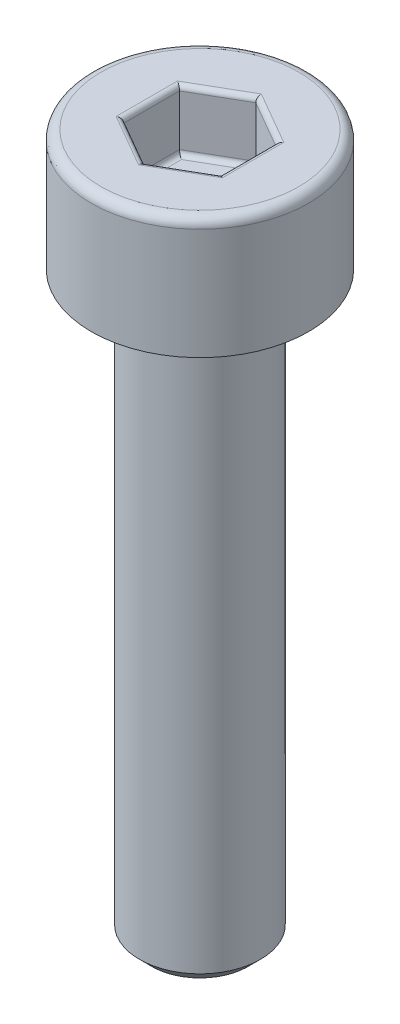
ISO-10303-21;
HEADER;
FILE_DESCRIPTION(('STEP AP214'),'2;1');
FILE_NAME('part.step','',(''),(''),'','','');
FILE_SCHEMA(('AUTOMOTIVE_DESIGN { 1 0 10303 214 1 1 1 1 }'));
ENDSEC;
DATA;
#1=APPLICATION_CONTEXT('core data for automotive mechanical design processes');
#2=APPLICATION_PROTOCOL_DEFINITION('international standard','automotive_design',2000,#1);
#3=PRODUCT_CONTEXT('',#1,'mechanical');
#4=PRODUCT('Part','Part','',(#3));
#5=PRODUCT_RELATED_PRODUCT_CATEGORY('part','',(#4));
#6=PRODUCT_DEFINITION_FORMATION('','',#4);
#7=PRODUCT_DEFINITION_CONTEXT('part definition',#1,'design');
#8=PRODUCT_DEFINITION('design','',#6,#7);
#9=PRODUCT_DEFINITION_SHAPE('','',#8);
#10=(LENGTH_UNIT() NAMED_UNIT(*) SI_UNIT(.MILLI.,.METRE.));
#11=(NAMED_UNIT(*) PLANE_ANGLE_UNIT() SI_UNIT($,.RADIAN.));
#12=(NAMED_UNIT(*) SI_UNIT($,.STERADIAN.) SOLID_ANGLE_UNIT());
#13=UNCERTAINTY_MEASURE_WITH_UNIT(LENGTH_MEASURE(1.E-05),#10,'distance_accuracy_value','');
#14=(GEOMETRIC_REPRESENTATION_CONTEXT(3) GLOBAL_UNCERTAINTY_ASSIGNED_CONTEXT((#13)) GLOBAL_UNIT_ASSIGNED_CONTEXT((#10,
#11,#12)) REPRESENTATION_CONTEXT('',''));
#15=CARTESIAN_POINT('',(0.,0.,0.));
#16=DIRECTION('',(0.,0.,1.));
#17=DIRECTION('',(1.,0.,0.));
#18=AXIS2_PLACEMENT_3D('',#15,#16,#17);
#19=CARTESIAN_POINT('',(0.,-14.5,0.));
#20=DIRECTION('',(0.,-1.,0.));
#21=DIRECTION('',(0.,0.,-1.));
#22=AXIS2_PLACEMENT_3D('',#19,#20,#21);
#23=PLANE('',#22);
#24=CARTESIAN_POINT('',(0.,-14.5,0.));
#25=DIRECTION('',(0.,-1.,0.));
#26=DIRECTION('',(0.,0.,-1.));
#27=AXIS2_PLACEMENT_3D('',#24,#25,#26);
#28=CIRCLE('',#27,0.999999999999996);
#29=CARTESIAN_POINT('',(0.,-14.5,-0.999999999999996));
#30=VERTEX_POINT('',#29);
#31=EDGE_CURVE('E261',#30,#30,#28,.T.);
#32=ORIENTED_EDGE('',*,*,#31,.T.);
#33=EDGE_LOOP('',(#32));
#34=FACE_BOUND('',#33,.T.);
#35=ADVANCED_FACE('F33',(#34),#23,.T.);
#36=CARTESIAN_POINT('',(0.,0.,0.));
#37=DIRECTION('',(0.,1.,0.));
#38=DIRECTION('',(0.,0.,1.));
#39=AXIS2_PLACEMENT_3D('',#36,#37,#38);
#40=CYLINDRICAL_SURFACE('',#39,1.25);
#41=CARTESIAN_POINT('',(0.,-2.75,0.));
#42=DIRECTION('',(0.,-1.,0.));
#43=DIRECTION('',(0.,0.,-1.));
#44=AXIS2_PLACEMENT_3D('',#41,#42,#43);
#45=CIRCLE('',#44,1.25);
#46=CARTESIAN_POINT('',(0.,-2.75,-1.25));
#47=VERTEX_POINT('',#46);
#48=EDGE_CURVE('E258',#47,#47,#45,.T.);
#49=ORIENTED_EDGE('',*,*,#48,.T.);
#50=EDGE_LOOP('',(#49));
#51=FACE_BOUND('',#50,.T.);
#52=CARTESIAN_POINT('',(0.,-14.25,0.));
#53=DIRECTION('',(0.,-1.,0.));
#54=DIRECTION('',(0.,0.,-1.));
#55=AXIS2_PLACEMENT_3D('',#52,#53,#54);
#56=CIRCLE('',#55,1.25);
#57=CARTESIAN_POINT('',(0.,-14.25,-1.25));
#58=VERTEX_POINT('',#57);
#59=EDGE_CURVE('E255',#58,#58,#56,.F.);
#60=ORIENTED_EDGE('',*,*,#59,.T.);
#61=EDGE_LOOP('',(#60));
#62=FACE_BOUND('',#61,.T.);
#63=ADVANCED_FACE('F287',(#51,#62),#40,.T.);
#64=CARTESIAN_POINT('',(-1.25,-2.5,0.));
#65=DIRECTION('',(0.,-1.,0.));
#66=DIRECTION('',(0.,0.,-1.));
#67=AXIS2_PLACEMENT_3D('',#64,#65,#66);
#68=PLANE('',#67);
#69=CARTESIAN_POINT('',(0.,-2.5,0.));
#70=DIRECTION('',(0.,-1.,0.));
#71=DIRECTION('',(0.,0.,-1.));
#72=AXIS2_PLACEMENT_3D('',#69,#70,#71);
#73=CIRCLE('',#72,1.5);
#74=CARTESIAN_POINT('',(0.,-2.5,-1.5));
#75=VERTEX_POINT('',#74);
#76=EDGE_CURVE('E252',#75,#75,#73,.F.);
#77=ORIENTED_EDGE('',*,*,#76,.T.);
#78=EDGE_LOOP('',(#77));
#79=FACE_BOUND('',#78,.T.);
#80=CARTESIAN_POINT('',(0.,-2.5,0.));
#81=DIRECTION('',(0.,1.,0.));
#82=DIRECTION('',(0.,0.,1.));
#83=AXIS2_PLACEMENT_3D('',#80,#81,#82);
#84=CIRCLE('',#83,2.25);
#85=CARTESIAN_POINT('',(0.,-2.5,2.25));
#86=VERTEX_POINT('',#85);
#87=EDGE_CURVE('E249',#86,#86,#84,.T.);
#88=ORIENTED_EDGE('',*,*,#87,.F.);
#89=EDGE_LOOP('',(#88));
#90=FACE_BOUND('',#89,.T.);
#91=ADVANCED_FACE('F293',(#79,#90),#68,.T.);
#92=CARTESIAN_POINT('',(0.,0.,0.));
#93=DIRECTION('',(0.,1.,0.));
#94=DIRECTION('',(0.,0.,1.));
#95=AXIS2_PLACEMENT_3D('',#92,#93,#94);
#96=CYLINDRICAL_SURFACE('',#95,2.25);
#97=CARTESIAN_POINT('',(0.,-0.2,0.));
#98=DIRECTION('',(0.,1.,0.));
#99=DIRECTION('',(0.,0.,1.));
#100=AXIS2_PLACEMENT_3D('',#97,#98,#99);
#101=CIRCLE('',#100,2.25);
#102=CARTESIAN_POINT('',(0.,-0.2,2.25));
#103=VERTEX_POINT('',#102);
#104=EDGE_CURVE('E159',#103,#103,#101,.F.);
#105=ORIENTED_EDGE('',*,*,#104,.T.);
#106=EDGE_LOOP('',(#105));
#107=FACE_BOUND('',#106,.T.);
#108=ORIENTED_EDGE('',*,*,#87,.T.);
#109=EDGE_LOOP('',(#108));
#110=FACE_BOUND('',#109,.T.);
#111=ADVANCED_FACE('F303',(#107,#110),#96,.T.);
#112=CARTESIAN_POINT('',(-2.25,0.,0.));
#113=DIRECTION('',(0.,1.,0.));
#114=DIRECTION('',(0.,0.,1.));
#115=AXIS2_PLACEMENT_3D('',#112,#113,#114);
#116=PLANE('',#115);
#117=DIRECTION('',(0.,0.,1.));
#118=VECTOR('',#117,1.);
#119=CARTESIAN_POINT('',(-1.1,0.,-0.577350269189627));
#120=LINE('',#119,#118);
#121=CARTESIAN_POINT('',(-1.1,0.,0.635085296108588));
#122=VERTEX_POINT('',#121);
#123=CARTESIAN_POINT('',(-1.1,0.,-0.635085296108589));
#124=VERTEX_POINT('',#123);
#125=EDGE_CURVE('E175',#122,#124,#120,.F.);
#126=ORIENTED_EDGE('',*,*,#125,.T.);
#127=DIRECTION('',(-0.866025403784439,0.,0.5));
#128=VECTOR('',#127,1.);
#129=CARTESIAN_POINT('',(-0.0500000000000009,0.,-1.2413030787577));
#130=LINE('',#129,#128);
#131=CARTESIAN_POINT('',(0.,0.,-1.27017059221718));
#132=VERTEX_POINT('',#131);
#133=EDGE_CURVE('E134',#124,#132,#130,.F.);
#134=ORIENTED_EDGE('',*,*,#133,.T.);
#135=DIRECTION('',(-0.866025403784439,0.,-0.5));
#136=VECTOR('',#135,1.);
#137=CARTESIAN_POINT('',(1.05,0.,-0.663952809568071));
#138=LINE('',#137,#136);
#139=CARTESIAN_POINT('',(1.1,0.,-0.63508529610859));
#140=VERTEX_POINT('',#139);
#141=EDGE_CURVE('E161',#132,#140,#138,.F.);
#142=ORIENTED_EDGE('',*,*,#141,.T.);
#143=DIRECTION('',(0.,0.,-1.));
#144=VECTOR('',#143,1.);
#145=CARTESIAN_POINT('',(1.1,0.,0.577350269189625));
#146=LINE('',#145,#144);
#147=CARTESIAN_POINT('',(1.1,0.,0.635085296108588));
#148=VERTEX_POINT('',#147);
#149=EDGE_CURVE('E169',#140,#148,#146,.F.);
#150=ORIENTED_EDGE('',*,*,#149,.T.);
#151=DIRECTION('',(0.866025403784439,0.,-0.5));
#152=VECTOR('',#151,1.);
#153=CARTESIAN_POINT('',(0.0499999999999991,0.,1.24130307875769));
#154=LINE('',#153,#152);
#155=CARTESIAN_POINT('',(0.,0.,1.27017059221718));
#156=VERTEX_POINT('',#155);
#157=EDGE_CURVE('E171',#148,#156,#154,.F.);
#158=ORIENTED_EDGE('',*,*,#157,.T.);
#159=DIRECTION('',(0.866025403784439,0.,0.5));
#160=VECTOR('',#159,1.);
#161=CARTESIAN_POINT('',(-1.05,0.,0.663952809568069));
#162=LINE('',#161,#160);
#163=EDGE_CURVE('E173',#156,#122,#162,.F.);
#164=ORIENTED_EDGE('',*,*,#163,.T.);
#165=EDGE_LOOP('',(#126,#134,#142,#150,#158,#164));
#166=FACE_BOUND('',#165,.T.);
#167=CARTESIAN_POINT('',(0.,0.,0.));
#168=DIRECTION('',(0.,1.,0.));
#169=DIRECTION('',(0.,0.,1.));
#170=AXIS2_PLACEMENT_3D('',#167,#168,#169);
#171=CIRCLE('',#170,2.05);
#172=CARTESIAN_POINT('',(0.,0.,2.05));
#173=VERTEX_POINT('',#172);
#174=EDGE_CURVE('E164',#173,#173,#171,.T.);
#175=ORIENTED_EDGE('',*,*,#174,.T.);
#176=EDGE_LOOP('',(#175));
#177=FACE_BOUND('',#176,.T.);
#178=ADVANCED_FACE('F266',(#166,#177),#116,.T.);
#179=CARTESIAN_POINT('',(0.,-2.5,0.));
#180=DIRECTION('',(0.,1.,0.));
#181=DIRECTION('',(0.,0.,1.));
#182=AXIS2_PLACEMENT_3D('',#179,#180,#181);
#183=CONICAL_SURFACE('',#182,1.5,0.78539816339745);
#184=ORIENTED_EDGE('',*,*,#48,.F.);
#185=EDGE_LOOP('',(#184));
#186=FACE_BOUND('',#185,.T.);
#187=ORIENTED_EDGE('',*,*,#76,.F.);
#188=EDGE_LOOP('',(#187));
#189=FACE_BOUND('',#188,.T.);
#190=ADVANCED_FACE('F281',(#186,#189),#183,.T.);
#191=CARTESIAN_POINT('',(0.,-14.25,0.));
#192=DIRECTION('',(0.,1.,0.));
#193=DIRECTION('',(0.,0.,1.));
#194=AXIS2_PLACEMENT_3D('',#191,#192,#193);
#195=CONICAL_SURFACE('',#194,1.25,0.785398163397454);
#196=ORIENTED_EDGE('',*,*,#31,.F.);
#197=EDGE_LOOP('',(#196));
#198=FACE_BOUND('',#197,.T.);
#199=ORIENTED_EDGE('',*,*,#59,.F.);
#200=EDGE_LOOP('',(#199));
#201=FACE_BOUND('',#200,.T.);
#202=ADVANCED_FACE('F271',(#198,#201),#195,.T.);
#203=CARTESIAN_POINT('',(0.,-0.2,0.));
#204=DIRECTION('',(0.,1.,0.));
#205=DIRECTION('',(0.,0.,1.));
#206=AXIS2_PLACEMENT_3D('',#203,#204,#205);
#207=TOROIDAL_SURFACE('',#206,2.05,0.2);
#208=ORIENTED_EDGE('',*,*,#104,.F.);
#209=EDGE_LOOP('',(#208));
#210=FACE_BOUND('',#209,.T.);
#211=ORIENTED_EDGE('',*,*,#174,.F.);
#212=EDGE_LOOP('',(#211));
#213=FACE_BOUND('',#212,.T.);
#214=ADVANCED_FACE('F268',(#210,#213),#207,.T.);
#215=CARTESIAN_POINT('',(0.999999999999998,-1.25,-0.577350269189627));
#216=DIRECTION('',(0.5,0.,-0.866025403784439));
#217=DIRECTION('',(-0.866025403784439,0.,-0.5));
#218=AXIS2_PLACEMENT_3D('',#215,#216,#217);
#219=PLANE('',#218);
#220=DIRECTION('',(0.,1.,0.));
#221=VECTOR('',#220,1.);
#222=CARTESIAN_POINT('',(0.999999999999998,-1.25,-0.577350269189627));
#223=LINE('',#222,#221);
#224=CARTESIAN_POINT('',(0.999999999999998,-1.15,-0.577350269189627));
#225=VERTEX_POINT('',#224);
#226=CARTESIAN_POINT('',(0.999999999999998,-0.1,-0.577350269189627));
#227=VERTEX_POINT('',#226);
#228=EDGE_CURVE('E243',#225,#227,#223,.T.);
#229=ORIENTED_EDGE('',*,*,#228,.T.);
#230=DIRECTION('',(-0.866025403784439,0.,-0.5));
#231=VECTOR('',#230,1.);
#232=CARTESIAN_POINT('',(0.,-0.1,-1.15470053837925));
#233=LINE('',#232,#231);
#234=CARTESIAN_POINT('',(0.,-0.1,-1.15470053837925));
#235=VERTEX_POINT('',#234);
#236=EDGE_CURVE('E195',#227,#235,#233,.T.);
#237=ORIENTED_EDGE('',*,*,#236,.T.);
#238=DIRECTION('',(0.,1.,0.));
#239=VECTOR('',#238,1.);
#240=CARTESIAN_POINT('',(0.,-1.25,-1.15470053837925));
#241=LINE('',#240,#239);
#242=CARTESIAN_POINT('',(0.,-1.15,-1.15470053837925));
#243=VERTEX_POINT('',#242);
#244=EDGE_CURVE('E145',#243,#235,#241,.T.);
#245=ORIENTED_EDGE('',*,*,#244,.F.);
#246=DIRECTION('',(-0.866025403784439,0.,-0.5));
#247=VECTOR('',#246,1.);
#248=CARTESIAN_POINT('',(0.999999999999998,-1.15,-0.577350269189627));
#249=LINE('',#248,#247);
#250=EDGE_CURVE('E193',#243,#225,#249,.F.);
#251=ORIENTED_EDGE('',*,*,#250,.T.);
#252=EDGE_LOOP('',(#229,#237,#245,#251));
#253=FACE_BOUND('',#252,.T.);
#254=ADVANCED_FACE('F270',(#253),#219,.F.);
#255=CARTESIAN_POINT('',(0.999999999999999,-1.25,0.577350269189625));
#256=DIRECTION('',(1.,0.,0.));
#257=DIRECTION('',(0.,0.,-1.));
#258=AXIS2_PLACEMENT_3D('',#255,#256,#257);
#259=PLANE('',#258);
#260=DIRECTION('',(0.,1.,0.));
#261=VECTOR('',#260,1.);
#262=CARTESIAN_POINT('',(0.999999999999999,-1.25,0.577350269189625));
#263=LINE('',#262,#261);
#264=CARTESIAN_POINT('',(0.999999999999999,-1.15,0.577350269189625));
#265=VERTEX_POINT('',#264);
#266=CARTESIAN_POINT('',(0.999999999999999,-0.1,0.577350269189625));
#267=VERTEX_POINT('',#266);
#268=EDGE_CURVE('E240',#265,#267,#263,.T.);
#269=ORIENTED_EDGE('',*,*,#268,.T.);
#270=DIRECTION('',(0.,0.,-1.));
#271=VECTOR('',#270,1.);
#272=CARTESIAN_POINT('',(0.999999999999998,-0.1,-0.577350269189627));
#273=LINE('',#272,#271);
#274=EDGE_CURVE('E191',#267,#227,#273,.T.);
#275=ORIENTED_EDGE('',*,*,#274,.T.);
#276=ORIENTED_EDGE('',*,*,#228,.F.);
#277=DIRECTION('',(0.,0.,-1.));
#278=VECTOR('',#277,1.);
#279=CARTESIAN_POINT('',(0.999999999999999,-1.15,0.577350269189625));
#280=LINE('',#279,#278);
#281=EDGE_CURVE('E188',#225,#265,#280,.F.);
#282=ORIENTED_EDGE('',*,*,#281,.T.);
#283=EDGE_LOOP('',(#269,#275,#276,#282));
#284=FACE_BOUND('',#283,.T.);
#285=ADVANCED_FACE('F278',(#284),#259,.F.);
#286=CARTESIAN_POINT('',(0.,-1.25,1.15470053837925));
#287=DIRECTION('',(0.5,0.,0.866025403784439));
#288=DIRECTION('',(0.866025403784439,0.,-0.5));
#289=AXIS2_PLACEMENT_3D('',#286,#287,#288);
#290=PLANE('',#289);
#291=DIRECTION('',(0.,1.,0.));
#292=VECTOR('',#291,1.);
#293=CARTESIAN_POINT('',(0.,-1.25,1.15470053837925));
#294=LINE('',#293,#292);
#295=CARTESIAN_POINT('',(0.,-1.15,1.15470053837925));
#296=VERTEX_POINT('',#295);
#297=CARTESIAN_POINT('',(0.,-0.1,1.15470053837925));
#298=VERTEX_POINT('',#297);
#299=EDGE_CURVE('E237',#296,#298,#294,.T.);
#300=ORIENTED_EDGE('',*,*,#299,.T.);
#301=DIRECTION('',(0.866025403784439,0.,-0.5));
#302=VECTOR('',#301,1.);
#303=CARTESIAN_POINT('',(0.999999999999999,-0.1,0.577350269189625));
#304=LINE('',#303,#302);
#305=EDGE_CURVE('E186',#298,#267,#304,.T.);
#306=ORIENTED_EDGE('',*,*,#305,.T.);
#307=ORIENTED_EDGE('',*,*,#268,.F.);
#308=DIRECTION('',(0.866025403784439,0.,-0.5));
#309=VECTOR('',#308,1.);
#310=CARTESIAN_POINT('',(0.,-1.15,1.15470053837925));
#311=LINE('',#310,#309);
#312=EDGE_CURVE('E184',#265,#296,#311,.F.);
#313=ORIENTED_EDGE('',*,*,#312,.T.);
#314=EDGE_LOOP('',(#300,#306,#307,#313));
#315=FACE_BOUND('',#314,.T.);
#316=ADVANCED_FACE('F327',(#315),#290,.F.);
#317=CARTESIAN_POINT('',(-1.,-1.25,0.577350269189625));
#318=DIRECTION('',(-0.5,0.,0.866025403784438));
#319=DIRECTION('',(0.866025403784439,0.,0.5));
#320=AXIS2_PLACEMENT_3D('',#317,#318,#319);
#321=PLANE('',#320);
#322=DIRECTION('',(0.,1.,0.));
#323=VECTOR('',#322,1.);
#324=CARTESIAN_POINT('',(-1.,-1.25,0.577350269189625));
#325=LINE('',#324,#323);
#326=CARTESIAN_POINT('',(-1.,-1.15,0.577350269189625));
#327=VERTEX_POINT('',#326);
#328=CARTESIAN_POINT('',(-1.,-0.1,0.577350269189625));
#329=VERTEX_POINT('',#328);
#330=EDGE_CURVE('E128',#327,#329,#325,.T.);
#331=ORIENTED_EDGE('',*,*,#330,.T.);
#332=DIRECTION('',(0.866025403784439,0.,0.5));
#333=VECTOR('',#332,1.);
#334=CARTESIAN_POINT('',(0.,-0.1,1.15470053837925));
#335=LINE('',#334,#333);
#336=EDGE_CURVE('E182',#329,#298,#335,.T.);
#337=ORIENTED_EDGE('',*,*,#336,.T.);
#338=ORIENTED_EDGE('',*,*,#299,.F.);
#339=DIRECTION('',(0.866025403784439,0.,0.5));
#340=VECTOR('',#339,1.);
#341=CARTESIAN_POINT('',(-1.,-1.15,0.577350269189625));
#342=LINE('',#341,#340);
#343=EDGE_CURVE('E180',#296,#327,#342,.F.);
#344=ORIENTED_EDGE('',*,*,#343,.T.);
#345=EDGE_LOOP('',(#331,#337,#338,#344));
#346=FACE_BOUND('',#345,.T.);
#347=ADVANCED_FACE('F234',(#346),#321,.F.);
#348=CARTESIAN_POINT('',(-1.,-1.25,-0.577350269189627));
#349=DIRECTION('',(-1.,0.,0.));
#350=DIRECTION('',(0.,0.,1.));
#351=AXIS2_PLACEMENT_3D('',#348,#349,#350);
#352=PLANE('',#351);
#353=DIRECTION('',(0.,1.,0.));
#354=VECTOR('',#353,1.);
#355=CARTESIAN_POINT('',(-1.,-1.25,-0.577350269189627));
#356=LINE('',#355,#354);
#357=CARTESIAN_POINT('',(-1.,-1.15,-0.577350269189627));
#358=VERTEX_POINT('',#357);
#359=CARTESIAN_POINT('',(-1.,-0.1,-0.577350269189627));
#360=VERTEX_POINT('',#359);
#361=EDGE_CURVE('E126',#358,#360,#356,.T.);
#362=ORIENTED_EDGE('',*,*,#361,.T.);
#363=DIRECTION('',(0.,0.,1.));
#364=VECTOR('',#363,1.);
#365=CARTESIAN_POINT('',(-1.,-0.1,0.577350269189625));
#366=LINE('',#365,#364);
#367=EDGE_CURVE('E133',#360,#329,#366,.T.);
#368=ORIENTED_EDGE('',*,*,#367,.T.);
#369=ORIENTED_EDGE('',*,*,#330,.F.);
#370=DIRECTION('',(0.,0.,1.));
#371=VECTOR('',#370,1.);
#372=CARTESIAN_POINT('',(-1.,-1.15,-0.577350269189627));
#373=LINE('',#372,#371);
#374=EDGE_CURVE('E123',#327,#358,#373,.F.);
#375=ORIENTED_EDGE('',*,*,#374,.T.);
#376=EDGE_LOOP('',(#362,#368,#369,#375));
#377=FACE_BOUND('',#376,.T.);
#378=ADVANCED_FACE('F125',(#377),#352,.F.);
#379=CARTESIAN_POINT('',(0.,-1.25,-1.15470053837925));
#380=DIRECTION('',(-0.5,0.,-0.866025403784438));
#381=DIRECTION('',(-0.866025403784439,0.,0.5));
#382=AXIS2_PLACEMENT_3D('',#379,#380,#381);
#383=PLANE('',#382);
#384=ORIENTED_EDGE('',*,*,#244,.T.);
#385=DIRECTION('',(-0.866025403784439,0.,0.5));
#386=VECTOR('',#385,1.);
#387=CARTESIAN_POINT('',(-1.,-0.1,-0.577350269189626));
#388=LINE('',#387,#386);
#389=EDGE_CURVE('E144',#235,#360,#388,.T.);
#390=ORIENTED_EDGE('',*,*,#389,.T.);
#391=ORIENTED_EDGE('',*,*,#361,.F.);
#392=DIRECTION('',(-0.866025403784439,0.,0.5));
#393=VECTOR('',#392,1.);
#394=CARTESIAN_POINT('',(0.,-1.15,-1.15470053837925));
#395=LINE('',#394,#393);
#396=EDGE_CURVE('E141',#358,#243,#395,.F.);
#397=ORIENTED_EDGE('',*,*,#396,.T.);
#398=EDGE_LOOP('',(#384,#390,#391,#397));
#399=FACE_BOUND('',#398,.T.);
#400=ADVANCED_FACE('F139',(#399),#383,.F.);
#401=CARTESIAN_POINT('',(0.,-1.25,-1.15470053837925));
#402=DIRECTION('',(0.,1.,0.));
#403=DIRECTION('',(0.,0.,1.));
#404=AXIS2_PLACEMENT_3D('',#401,#402,#403);
#405=PLANE('',#404);
#406=DIRECTION('',(0.866025403784439,0.,-0.5));
#407=VECTOR('',#406,1.);
#408=CARTESIAN_POINT('',(0.949999999999999,-1.25,0.490747728811181));
#409=LINE('',#408,#407);
#410=CARTESIAN_POINT('',(0.,-1.25,1.03923048454133));
#411=VERTEX_POINT('',#410);
#412=CARTESIAN_POINT('',(0.899999999999999,-1.25,0.519615242270663));
#413=VERTEX_POINT('',#412);
#414=EDGE_CURVE('E42',#411,#413,#409,.T.);
#415=ORIENTED_EDGE('',*,*,#414,.T.);
#416=DIRECTION('',(0.,0.,-1.));
#417=VECTOR('',#416,1.);
#418=CARTESIAN_POINT('',(0.899999999999998,-1.25,-1.15470053837925));
#419=LINE('',#418,#417);
#420=CARTESIAN_POINT('',(0.899999999999998,-1.25,-0.519615242270664));
#421=VERTEX_POINT('',#420);
#422=EDGE_CURVE('E11',#413,#421,#419,.T.);
#423=ORIENTED_EDGE('',*,*,#422,.T.);
#424=DIRECTION('',(-0.866025403784439,0.,-0.5));
#425=VECTOR('',#424,1.);
#426=CARTESIAN_POINT('',(-0.0500000000000008,-1.25,-1.06809799800081));
#427=LINE('',#426,#425);
#428=CARTESIAN_POINT('',(0.,-1.25,-1.03923048454133));
#429=VERTEX_POINT('',#428);
#430=EDGE_CURVE('E197',#421,#429,#427,.T.);
#431=ORIENTED_EDGE('',*,*,#430,.T.);
#432=DIRECTION('',(-0.866025403784439,0.,0.5));
#433=VECTOR('',#432,1.);
#434=CARTESIAN_POINT('',(0.0499999999999993,-1.25,-1.06809799800081));
#435=LINE('',#434,#433);
#436=CARTESIAN_POINT('',(-0.9,-1.25,-0.519615242270664));
#437=VERTEX_POINT('',#436);
#438=EDGE_CURVE('E199',#429,#437,#435,.T.);
#439=ORIENTED_EDGE('',*,*,#438,.T.);
#440=DIRECTION('',(0.,0.,1.));
#441=VECTOR('',#440,1.);
#442=CARTESIAN_POINT('',(-0.9,-1.25,-1.15470053837925));
#443=LINE('',#442,#441);
#444=CARTESIAN_POINT('',(-0.9,-1.25,0.519615242270662));
#445=VERTEX_POINT('',#444);
#446=EDGE_CURVE('E150',#437,#445,#443,.T.);
#447=ORIENTED_EDGE('',*,*,#446,.T.);
#448=DIRECTION('',(0.866025403784439,0.,0.5));
#449=VECTOR('',#448,1.);
#450=CARTESIAN_POINT('',(-0.950000000000001,-1.25,0.490747728811181));
#451=LINE('',#450,#449);
#452=EDGE_CURVE('E53',#445,#411,#451,.T.);
#453=ORIENTED_EDGE('',*,*,#452,.T.);
#454=EDGE_LOOP('',(#415,#423,#431,#439,#447,#453));
#455=FACE_BOUND('',#454,.T.);
#456=ADVANCED_FACE('F322',(#455),#405,.T.);
#457=CARTESIAN_POINT('',(0.0499999999999991,-0.1,1.24130307875769));
#458=DIRECTION('',(-0.866025403784439,0.,0.5));
#459=DIRECTION('',(0.5,0.,0.866025403784439));
#460=AXIS2_PLACEMENT_3D('',#457,#458,#459);
#461=CYLINDRICAL_SURFACE('',#460,0.1);
#462=CARTESIAN_POINT('',(0.,-0.1,1.27017059221718));
#463=DIRECTION('',(-1.,0.,0.));
#464=DIRECTION('',(0.,0.,-1.));
#465=AXIS2_PLACEMENT_3D('',#462,#463,#464);
#466=ELLIPSE('',#465,0.115470053837925,0.1);
#467=EDGE_CURVE('E214',#156,#298,#466,.T.);
#468=ORIENTED_EDGE('',*,*,#467,.F.);
#469=ORIENTED_EDGE('',*,*,#157,.F.);
#470=CARTESIAN_POINT('',(1.1,-0.1,0.635085296108588));
#471=DIRECTION('',(-0.5,0.,0.866025403784439));
#472=DIRECTION('',(-0.866025403784439,0.,-0.5));
#473=AXIS2_PLACEMENT_3D('',#470,#471,#472);
#474=ELLIPSE('',#473,0.115470053837925,0.1);
#475=EDGE_CURVE('E217',#267,#148,#474,.F.);
#476=ORIENTED_EDGE('',*,*,#475,.F.);
#477=ORIENTED_EDGE('',*,*,#305,.F.);
#478=EDGE_LOOP('',(#468,#469,#476,#477));
#479=FACE_BOUND('',#478,.T.);
#480=ADVANCED_FACE('F334',(#479),#461,.T.);
#481=CARTESIAN_POINT('',(1.1,-0.1,0.577350269189625));
#482=DIRECTION('',(0.,0.,1.));
#483=DIRECTION('',(1.,0.,0.));
#484=AXIS2_PLACEMENT_3D('',#481,#482,#483);
#485=CYLINDRICAL_SURFACE('',#484,0.1);
#486=ORIENTED_EDGE('',*,*,#475,.T.);
#487=ORIENTED_EDGE('',*,*,#149,.F.);
#488=CARTESIAN_POINT('',(1.1,-0.1,-0.63508529610859));
#489=DIRECTION('',(0.5,0.,0.866025403784439));
#490=DIRECTION('',(-0.866025403784439,0.,0.5));
#491=AXIS2_PLACEMENT_3D('',#488,#489,#490);
#492=ELLIPSE('',#491,0.115470053837925,0.1);
#493=EDGE_CURVE('E211',#227,#140,#492,.F.);
#494=ORIENTED_EDGE('',*,*,#493,.F.);
#495=ORIENTED_EDGE('',*,*,#274,.F.);
#496=EDGE_LOOP('',(#486,#487,#494,#495));
#497=FACE_BOUND('',#496,.T.);
#498=ADVANCED_FACE('F338',(#497),#485,.T.);
#499=CARTESIAN_POINT('',(-1.05,-0.1,0.663952809568069));
#500=DIRECTION('',(-0.866025403784439,0.,-0.5));
#501=DIRECTION('',(-0.5,0.,0.866025403784438));
#502=AXIS2_PLACEMENT_3D('',#499,#500,#501);
#503=CYLINDRICAL_SURFACE('',#502,0.1);
#504=ORIENTED_EDGE('',*,*,#467,.T.);
#505=ORIENTED_EDGE('',*,*,#336,.F.);
#506=CARTESIAN_POINT('',(-1.1,-0.1,0.635085296108587));
#507=DIRECTION('',(-0.5,0.,-0.866025403784439));
#508=DIRECTION('',(0.866025403784439,0.,-0.5));
#509=AXIS2_PLACEMENT_3D('',#506,#507,#508);
#510=ELLIPSE('',#509,0.115470053837925,0.1);
#511=EDGE_CURVE('E208',#122,#329,#510,.T.);
#512=ORIENTED_EDGE('',*,*,#511,.F.);
#513=ORIENTED_EDGE('',*,*,#163,.F.);
#514=EDGE_LOOP('',(#504,#505,#512,#513));
#515=FACE_BOUND('',#514,.T.);
#516=ADVANCED_FACE('F344',(#515),#503,.T.);
#517=CARTESIAN_POINT('',(1.05,-0.1,-0.663952809568071));
#518=DIRECTION('',(0.866025403784439,0.,0.5));
#519=DIRECTION('',(0.5,0.,-0.866025403784439));
#520=AXIS2_PLACEMENT_3D('',#517,#518,#519);
#521=CYLINDRICAL_SURFACE('',#520,0.1);
#522=ORIENTED_EDGE('',*,*,#493,.T.);
#523=ORIENTED_EDGE('',*,*,#141,.F.);
#524=CARTESIAN_POINT('',(0.,-0.1,-1.27017059221718));
#525=DIRECTION('',(1.,0.,0.));
#526=DIRECTION('',(0.,0.,-1.));
#527=AXIS2_PLACEMENT_3D('',#524,#525,#526);
#528=ELLIPSE('',#527,0.115470053837925,0.1);
#529=EDGE_CURVE('E206',#235,#132,#528,.F.);
#530=ORIENTED_EDGE('',*,*,#529,.F.);
#531=ORIENTED_EDGE('',*,*,#236,.F.);
#532=EDGE_LOOP('',(#522,#523,#530,#531));
#533=FACE_BOUND('',#532,.T.);
#534=ADVANCED_FACE('F374',(#533),#521,.T.);
#535=CARTESIAN_POINT('',(-1.1,-0.1,-0.577350269189627));
#536=DIRECTION('',(0.,0.,-1.));
#537=DIRECTION('',(-1.,0.,0.));
#538=AXIS2_PLACEMENT_3D('',#535,#536,#537);
#539=CYLINDRICAL_SURFACE('',#538,0.1);
#540=ORIENTED_EDGE('',*,*,#511,.T.);
#541=ORIENTED_EDGE('',*,*,#367,.F.);
#542=CARTESIAN_POINT('',(-1.1,-0.1,-0.635085296108589));
#543=DIRECTION('',(0.5,0.,-0.866025403784439));
#544=DIRECTION('',(0.866025403784439,0.,0.5));
#545=AXIS2_PLACEMENT_3D('',#542,#543,#544);
#546=ELLIPSE('',#545,0.115470053837925,0.1);
#547=EDGE_CURVE('E204',#124,#360,#546,.T.);
#548=ORIENTED_EDGE('',*,*,#547,.F.);
#549=ORIENTED_EDGE('',*,*,#125,.F.);
#550=EDGE_LOOP('',(#540,#541,#548,#549));
#551=FACE_BOUND('',#550,.T.);
#552=ADVANCED_FACE('F369',(#551),#539,.T.);
#553=CARTESIAN_POINT('',(-0.0500000000000009,-0.1,-1.2413030787577));
#554=DIRECTION('',(0.866025403784439,0.,-0.5));
#555=DIRECTION('',(-0.5,0.,-0.866025403784438));
#556=AXIS2_PLACEMENT_3D('',#553,#554,#555);
#557=CYLINDRICAL_SURFACE('',#556,0.1);
#558=ORIENTED_EDGE('',*,*,#529,.T.);
#559=ORIENTED_EDGE('',*,*,#133,.F.);
#560=ORIENTED_EDGE('',*,*,#547,.T.);
#561=ORIENTED_EDGE('',*,*,#389,.F.);
#562=EDGE_LOOP('',(#558,#559,#560,#561));
#563=FACE_BOUND('',#562,.T.);
#564=ADVANCED_FACE('F365',(#563),#557,.T.);
#565=CARTESIAN_POINT('',(-0.9,-1.15,-1.15470053837925));
#566=DIRECTION('',(0.,0.,1.));
#567=DIRECTION('',(1.,0.,0.));
#568=AXIS2_PLACEMENT_3D('',#565,#566,#567);
#569=CYLINDRICAL_SURFACE('',#568,0.1);
#570=CARTESIAN_POINT('',(-0.900000000000001,-1.15,-0.519615242270664));
#571=DIRECTION('',(-0.5,0.,0.866025403784439));
#572=DIRECTION('',(0.866025403784439,0.,0.5));
#573=AXIS2_PLACEMENT_3D('',#570,#571,#572);
#574=ELLIPSE('',#573,0.115470053837925,0.1);
#575=EDGE_CURVE('E149',#358,#437,#574,.T.);
#576=ORIENTED_EDGE('',*,*,#575,.F.);
#577=ORIENTED_EDGE('',*,*,#374,.F.);
#578=CARTESIAN_POINT('',(-0.9,-1.15,0.519615242270662));
#579=DIRECTION('',(0.5,0.,0.866025403784439));
#580=DIRECTION('',(0.866025403784439,0.,-0.5));
#581=AXIS2_PLACEMENT_3D('',#578,#579,#580);
#582=ELLIPSE('',#581,0.115470053837925,0.1);
#583=EDGE_CURVE('E37',#445,#327,#582,.F.);
#584=ORIENTED_EDGE('',*,*,#583,.F.);
#585=ORIENTED_EDGE('',*,*,#446,.F.);
#586=EDGE_LOOP('',(#576,#577,#584,#585));
#587=FACE_BOUND('',#586,.T.);
#588=ADVANCED_FACE('F35',(#587),#569,.F.);
#589=CARTESIAN_POINT('',(-0.950000000000001,-1.15,0.490747728811181));
#590=DIRECTION('',(0.866025403784439,0.,0.5));
#591=DIRECTION('',(0.5,0.,-0.866025403784438));
#592=AXIS2_PLACEMENT_3D('',#589,#590,#591);
#593=CYLINDRICAL_SURFACE('',#592,0.1);
#594=ORIENTED_EDGE('',*,*,#583,.T.);
#595=ORIENTED_EDGE('',*,*,#343,.F.);
#596=CARTESIAN_POINT('',(0.,-1.15,1.03923048454133));
#597=DIRECTION('',(1.,0.,0.));
#598=DIRECTION('',(0.,0.,-1.));
#599=AXIS2_PLACEMENT_3D('',#596,#597,#598);
#600=ELLIPSE('',#599,0.115470053837925,0.1);
#601=EDGE_CURVE('E153',#411,#296,#600,.F.);
#602=ORIENTED_EDGE('',*,*,#601,.F.);
#603=ORIENTED_EDGE('',*,*,#452,.F.);
#604=EDGE_LOOP('',(#594,#595,#602,#603));
#605=FACE_BOUND('',#604,.T.);
#606=ADVANCED_FACE('F231',(#605),#593,.F.);
#607=CARTESIAN_POINT('',(0.0499999999999993,-1.15,-1.06809799800081));
#608=DIRECTION('',(-0.866025403784439,0.,0.5));
#609=DIRECTION('',(0.5,0.,0.866025403784438));
#610=AXIS2_PLACEMENT_3D('',#607,#608,#609);
#611=CYLINDRICAL_SURFACE('',#610,0.1);
#612=ORIENTED_EDGE('',*,*,#575,.T.);
#613=ORIENTED_EDGE('',*,*,#438,.F.);
#614=CARTESIAN_POINT('',(0.,-1.15,-1.03923048454133));
#615=DIRECTION('',(-1.,0.,0.));
#616=DIRECTION('',(0.,0.,1.));
#617=AXIS2_PLACEMENT_3D('',#614,#615,#616);
#618=ELLIPSE('',#617,0.115470053837925,0.1);
#619=EDGE_CURVE('E157',#243,#429,#618,.T.);
#620=ORIENTED_EDGE('',*,*,#619,.F.);
#621=ORIENTED_EDGE('',*,*,#396,.F.);
#622=EDGE_LOOP('',(#612,#613,#620,#621));
#623=FACE_BOUND('',#622,.T.);
#624=ADVANCED_FACE('F155',(#623),#611,.F.);
#625=CARTESIAN_POINT('',(0.949999999999999,-1.15,0.490747728811181));
#626=DIRECTION('',(0.866025403784439,0.,-0.5));
#627=DIRECTION('',(-0.5,0.,-0.866025403784439));
#628=AXIS2_PLACEMENT_3D('',#625,#626,#627);
#629=CYLINDRICAL_SURFACE('',#628,0.1);
#630=ORIENTED_EDGE('',*,*,#601,.T.);
#631=ORIENTED_EDGE('',*,*,#312,.F.);
#632=CARTESIAN_POINT('',(0.899999999999999,-1.15,0.519615242270662));
#633=DIRECTION('',(0.5,0.,-0.866025403784439));
#634=DIRECTION('',(-0.866025403784439,0.,-0.5));
#635=AXIS2_PLACEMENT_3D('',#632,#633,#634);
#636=ELLIPSE('',#635,0.115470053837925,0.1);
#637=EDGE_CURVE('E222',#413,#265,#636,.F.);
#638=ORIENTED_EDGE('',*,*,#637,.F.);
#639=ORIENTED_EDGE('',*,*,#414,.F.);
#640=EDGE_LOOP('',(#630,#631,#638,#639));
#641=FACE_BOUND('',#640,.T.);
#642=ADVANCED_FACE('F228',(#641),#629,.F.);
#643=CARTESIAN_POINT('',(-0.0500000000000008,-1.15,-1.06809799800081));
#644=DIRECTION('',(-0.866025403784439,0.,-0.5));
#645=DIRECTION('',(-0.5,0.,0.866025403784439));
#646=AXIS2_PLACEMENT_3D('',#643,#644,#645);
#647=CYLINDRICAL_SURFACE('',#646,0.1);
#648=ORIENTED_EDGE('',*,*,#619,.T.);
#649=ORIENTED_EDGE('',*,*,#430,.F.);
#650=CARTESIAN_POINT('',(0.899999999999998,-1.15,-0.519615242270664));
#651=DIRECTION('',(-0.5,0.,-0.866025403784439));
#652=DIRECTION('',(0.866025403784439,0.,-0.5));
#653=AXIS2_PLACEMENT_3D('',#650,#651,#652);
#654=ELLIPSE('',#653,0.115470053837925,0.1);
#655=EDGE_CURVE('E220',#225,#421,#654,.T.);
#656=ORIENTED_EDGE('',*,*,#655,.F.);
#657=ORIENTED_EDGE('',*,*,#250,.F.);
#658=EDGE_LOOP('',(#648,#649,#656,#657));
#659=FACE_BOUND('',#658,.T.);
#660=ADVANCED_FACE('F353',(#659),#647,.F.);
#661=CARTESIAN_POINT('',(0.899999999999998,-1.15,-1.15470053837925));
#662=DIRECTION('',(0.,0.,-1.));
#663=DIRECTION('',(-1.,0.,0.));
#664=AXIS2_PLACEMENT_3D('',#661,#662,#663);
#665=CYLINDRICAL_SURFACE('',#664,0.1);
#666=ORIENTED_EDGE('',*,*,#637,.T.);
#667=ORIENTED_EDGE('',*,*,#281,.F.);
#668=ORIENTED_EDGE('',*,*,#655,.T.);
#669=ORIENTED_EDGE('',*,*,#422,.F.);
#670=EDGE_LOOP('',(#666,#667,#668,#669));
#671=FACE_BOUND('',#670,.T.);
#672=ADVANCED_FACE('F350',(#671),#665,.F.);
#673=CLOSED_SHELL('',(#35,#63,#91,#111,#178,#190,#202,#214,#254,#285,#316,#347,#378,#400,#456,
#480,#498,#516,#534,#552,#564,#588,#606,#624,#642,#660,#672));
#674=MANIFOLD_SOLID_BREP('B2',#673);
#675=ADVANCED_BREP_SHAPE_REPRESENTATION('',(#18,#674),#14);
#676=SHAPE_DEFINITION_REPRESENTATION(#9,#675);
ENDSEC;
END-ISO-10303-21;
